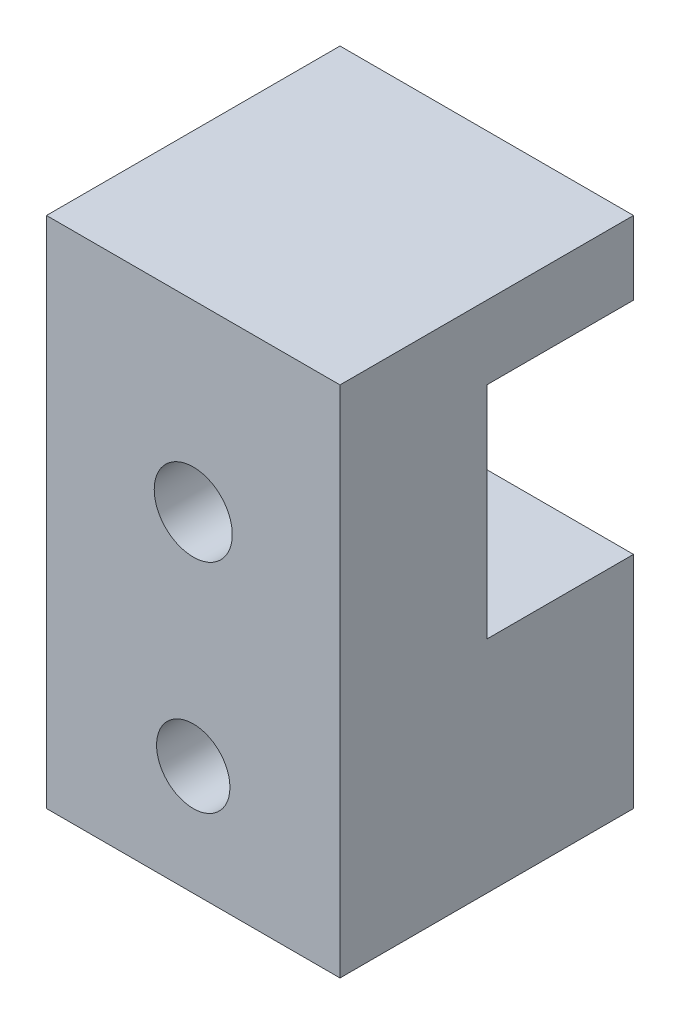
ISO-10303-21;
HEADER;
FILE_DESCRIPTION(('STEP AP214'),'2;1');
FILE_NAME('part.step','',(''),(''),'','','');
FILE_SCHEMA(('AUTOMOTIVE_DESIGN { 1 0 10303 214 1 1 1 1 }'));
ENDSEC;
DATA;
#1=APPLICATION_CONTEXT('core data for automotive mechanical design processes');
#2=APPLICATION_PROTOCOL_DEFINITION('international standard','automotive_design',2000,#1);
#3=PRODUCT_CONTEXT('',#1,'mechanical');
#4=PRODUCT('Part','Part','',(#3));
#5=PRODUCT_RELATED_PRODUCT_CATEGORY('part','',(#4));
#6=PRODUCT_DEFINITION_FORMATION('','',#4);
#7=PRODUCT_DEFINITION_CONTEXT('part definition',#1,'design');
#8=PRODUCT_DEFINITION('design','',#6,#7);
#9=PRODUCT_DEFINITION_SHAPE('','',#8);
#10=(LENGTH_UNIT() NAMED_UNIT(*) SI_UNIT(.MILLI.,.METRE.));
#11=(NAMED_UNIT(*) PLANE_ANGLE_UNIT() SI_UNIT($,.RADIAN.));
#12=(NAMED_UNIT(*) SI_UNIT($,.STERADIAN.) SOLID_ANGLE_UNIT());
#13=UNCERTAINTY_MEASURE_WITH_UNIT(LENGTH_MEASURE(1.E-05),#10,'distance_accuracy_value','');
#14=(GEOMETRIC_REPRESENTATION_CONTEXT(3) GLOBAL_UNCERTAINTY_ASSIGNED_CONTEXT((#13)) GLOBAL_UNIT_ASSIGNED_CONTEXT((#10,
#11,#12)) REPRESENTATION_CONTEXT('',''));
#15=CARTESIAN_POINT('',(0.,0.,0.));
#16=DIRECTION('',(0.,0.,1.));
#17=DIRECTION('',(1.,0.,0.));
#18=AXIS2_PLACEMENT_3D('',#15,#16,#17);
#19=CARTESIAN_POINT('',(0.,0.,-12.7));
#20=DIRECTION('',(0.,0.,-1.));
#21=DIRECTION('',(-1.,0.,0.));
#22=AXIS2_PLACEMENT_3D('',#19,#20,#21);
#23=PLANE('',#22);
#24=CARTESIAN_POINT('',(0.,-12.7,-12.7));
#25=DIRECTION('',(0.,0.,1.));
#26=DIRECTION('',(1.,0.,0.));
#27=AXIS2_PLACEMENT_3D('',#24,#25,#26);
#28=CIRCLE('',#27,3.175);
#29=CARTESIAN_POINT('',(3.175,-12.7,-12.7));
#30=VERTEX_POINT('',#29);
#31=EDGE_CURVE('E194',#30,#30,#28,.T.);
#32=ORIENTED_EDGE('',*,*,#31,.T.);
#33=EDGE_LOOP('',(#32));
#34=FACE_BOUND('',#33,.T.);
#35=DIRECTION('',(-1.,0.,0.));
#36=VECTOR('',#35,1.);
#37=CARTESIAN_POINT('',(12.7,-3.17500000000001,-12.7));
#38=LINE('',#37,#36);
#39=CARTESIAN_POINT('',(12.7,-3.17500000000001,-12.7));
#40=VERTEX_POINT('',#39);
#41=CARTESIAN_POINT('',(-12.7,-3.17500000000001,-12.7));
#42=VERTEX_POINT('',#41);
#43=EDGE_CURVE('E131',#40,#42,#38,.T.);
#44=ORIENTED_EDGE('',*,*,#43,.F.);
#45=DIRECTION('',(0.,1.,0.));
#46=VECTOR('',#45,1.);
#47=CARTESIAN_POINT('',(12.7,-22.225,-12.7));
#48=LINE('',#47,#46);
#49=CARTESIAN_POINT('',(12.7,-22.225,-12.7));
#50=VERTEX_POINT('',#49);
#51=EDGE_CURVE('E166',#50,#40,#48,.T.);
#52=ORIENTED_EDGE('',*,*,#51,.F.);
#53=DIRECTION('',(1.,0.,0.));
#54=VECTOR('',#53,1.);
#55=CARTESIAN_POINT('',(-12.7,-22.225,-12.7));
#56=LINE('',#55,#54);
#57=CARTESIAN_POINT('',(-12.7,-22.225,-12.7));
#58=VERTEX_POINT('',#57);
#59=EDGE_CURVE('E148',#58,#50,#56,.T.);
#60=ORIENTED_EDGE('',*,*,#59,.F.);
#61=DIRECTION('',(0.,1.,0.));
#62=VECTOR('',#61,1.);
#63=CARTESIAN_POINT('',(-12.7,-22.225,-12.7));
#64=LINE('',#63,#62);
#65=EDGE_CURVE('E157',#58,#42,#64,.T.);
#66=ORIENTED_EDGE('',*,*,#65,.T.);
#67=EDGE_LOOP('',(#44,#52,#60,#66));
#68=FACE_BOUND('',#67,.T.);
#69=ADVANCED_FACE('F41',(#34,#68),#23,.T.);
#70=CARTESIAN_POINT('',(-12.7,-22.225,12.7));
#71=DIRECTION('',(-1.,0.,0.));
#72=DIRECTION('',(0.,0.,1.));
#73=AXIS2_PLACEMENT_3D('',#70,#71,#72);
#74=PLANE('',#73);
#75=DIRECTION('',(0.,0.,-1.));
#76=VECTOR('',#75,1.);
#77=CARTESIAN_POINT('',(-12.7,-3.17500000000001,0.));
#78=LINE('',#77,#76);
#79=CARTESIAN_POINT('',(-12.7,-3.17500000000001,0.));
#80=VERTEX_POINT('',#79);
#81=EDGE_CURVE('E186',#80,#42,#78,.T.);
#82=ORIENTED_EDGE('',*,*,#81,.T.);
#83=ORIENTED_EDGE('',*,*,#65,.F.);
#84=DIRECTION('',(0.,0.,-1.));
#85=VECTOR('',#84,1.);
#86=CARTESIAN_POINT('',(-12.7,-22.225,12.7));
#87=LINE('',#86,#85);
#88=CARTESIAN_POINT('',(-12.7,-22.225,12.7));
#89=VERTEX_POINT('',#88);
#90=EDGE_CURVE('E11',#89,#58,#87,.T.);
#91=ORIENTED_EDGE('',*,*,#90,.F.);
#92=DIRECTION('',(0.,1.,0.));
#93=VECTOR('',#92,1.);
#94=CARTESIAN_POINT('',(-12.7,-22.225,12.7));
#95=LINE('',#94,#93);
#96=CARTESIAN_POINT('',(-12.7,22.225,12.7));
#97=VERTEX_POINT('',#96);
#98=EDGE_CURVE('E144',#89,#97,#95,.T.);
#99=ORIENTED_EDGE('',*,*,#98,.T.);
#100=DIRECTION('',(0.,0.,-1.));
#101=VECTOR('',#100,1.);
#102=CARTESIAN_POINT('',(-12.7,22.225,12.7));
#103=LINE('',#102,#101);
#104=CARTESIAN_POINT('',(-12.7,22.225,-12.7));
#105=VERTEX_POINT('',#104);
#106=EDGE_CURVE('E45',#97,#105,#103,.T.);
#107=ORIENTED_EDGE('',*,*,#106,.T.);
#108=CARTESIAN_POINT('',(-12.7,15.875,-12.7));
#109=VERTEX_POINT('',#108);
#110=EDGE_CURVE('E134',#109,#105,#64,.T.);
#111=ORIENTED_EDGE('',*,*,#110,.F.);
#112=DIRECTION('',(0.,0.,-1.));
#113=VECTOR('',#112,1.);
#114=CARTESIAN_POINT('',(-12.7,15.875,0.));
#115=LINE('',#114,#113);
#116=CARTESIAN_POINT('',(-12.7,15.875,0.));
#117=VERTEX_POINT('',#116);
#118=EDGE_CURVE('E59',#117,#109,#115,.T.);
#119=ORIENTED_EDGE('',*,*,#118,.F.);
#120=DIRECTION('',(0.,1.,0.));
#121=VECTOR('',#120,1.);
#122=CARTESIAN_POINT('',(-12.7,-3.17500000000001,0.));
#123=LINE('',#122,#121);
#124=EDGE_CURVE('E122',#80,#117,#123,.T.);
#125=ORIENTED_EDGE('',*,*,#124,.F.);
#126=EDGE_LOOP('',(#82,#83,#91,#99,#107,#111,#119,#125));
#127=FACE_BOUND('',#126,.T.);
#128=ADVANCED_FACE('F43',(#127),#74,.T.);
#129=CARTESIAN_POINT('',(-12.7,-22.225,12.7));
#130=DIRECTION('',(0.,1.,0.));
#131=DIRECTION('',(0.,0.,1.));
#132=AXIS2_PLACEMENT_3D('',#129,#130,#131);
#133=PLANE('',#132);
#134=CARTESIAN_POINT('',(0.,-22.225,0.));
#135=DIRECTION('',(0.,-1.,0.));
#136=DIRECTION('',(0.,0.,-1.));
#137=AXIS2_PLACEMENT_3D('',#134,#135,#136);
#138=CIRCLE('',#137,1.35254999999999);
#139=CARTESIAN_POINT('',(0.,-22.225,-1.35254999999999));
#140=VERTEX_POINT('',#139);
#141=EDGE_CURVE('E222',#140,#140,#138,.T.);
#142=ORIENTED_EDGE('',*,*,#141,.F.);
#143=EDGE_LOOP('',(#142));
#144=FACE_BOUND('',#143,.T.);
#145=ORIENTED_EDGE('',*,*,#59,.T.);
#146=DIRECTION('',(0.,0.,-1.));
#147=VECTOR('',#146,1.);
#148=CARTESIAN_POINT('',(12.7,-22.225,12.7));
#149=LINE('',#148,#147);
#150=CARTESIAN_POINT('',(12.7,-22.225,12.7));
#151=VERTEX_POINT('',#150);
#152=EDGE_CURVE('E51',#151,#50,#149,.T.);
#153=ORIENTED_EDGE('',*,*,#152,.F.);
#154=DIRECTION('',(1.,0.,0.));
#155=VECTOR('',#154,1.);
#156=CARTESIAN_POINT('',(-12.7,-22.225,12.7));
#157=LINE('',#156,#155);
#158=EDGE_CURVE('E154',#89,#151,#157,.T.);
#159=ORIENTED_EDGE('',*,*,#158,.F.);
#160=ORIENTED_EDGE('',*,*,#90,.T.);
#161=EDGE_LOOP('',(#145,#153,#159,#160));
#162=FACE_BOUND('',#161,.T.);
#163=ADVANCED_FACE('F243',(#144,#162),#133,.F.);
#164=CARTESIAN_POINT('',(12.7,-22.225,12.7));
#165=DIRECTION('',(-1.,0.,0.));
#166=DIRECTION('',(0.,0.,1.));
#167=AXIS2_PLACEMENT_3D('',#164,#165,#166);
#168=PLANE('',#167);
#169=ORIENTED_EDGE('',*,*,#51,.T.);
#170=DIRECTION('',(0.,0.,-1.));
#171=VECTOR('',#170,1.);
#172=CARTESIAN_POINT('',(12.7,-3.17500000000001,0.));
#173=LINE('',#172,#171);
#174=CARTESIAN_POINT('',(12.7,-3.17500000000001,0.));
#175=VERTEX_POINT('',#174);
#176=EDGE_CURVE('E139',#175,#40,#173,.T.);
#177=ORIENTED_EDGE('',*,*,#176,.F.);
#178=DIRECTION('',(0.,-1.,0.));
#179=VECTOR('',#178,1.);
#180=CARTESIAN_POINT('',(12.7,-3.17500000000001,0.));
#181=LINE('',#180,#179);
#182=CARTESIAN_POINT('',(12.7,15.875,0.));
#183=VERTEX_POINT('',#182);
#184=EDGE_CURVE('E121',#183,#175,#181,.T.);
#185=ORIENTED_EDGE('',*,*,#184,.F.);
#186=DIRECTION('',(0.,0.,-1.));
#187=VECTOR('',#186,1.);
#188=CARTESIAN_POINT('',(12.7,15.875,0.));
#189=LINE('',#188,#187);
#190=CARTESIAN_POINT('',(12.7,15.875,-12.7));
#191=VERTEX_POINT('',#190);
#192=EDGE_CURVE('E117',#183,#191,#189,.T.);
#193=ORIENTED_EDGE('',*,*,#192,.T.);
#194=CARTESIAN_POINT('',(12.7,22.225,-12.7));
#195=VERTEX_POINT('',#194);
#196=EDGE_CURVE('E165',#191,#195,#48,.T.);
#197=ORIENTED_EDGE('',*,*,#196,.T.);
#198=DIRECTION('',(0.,0.,-1.));
#199=VECTOR('',#198,1.);
#200=CARTESIAN_POINT('',(12.7,22.225,12.7));
#201=LINE('',#200,#199);
#202=CARTESIAN_POINT('',(12.7,22.225,12.7));
#203=VERTEX_POINT('',#202);
#204=EDGE_CURVE('E174',#203,#195,#201,.T.);
#205=ORIENTED_EDGE('',*,*,#204,.F.);
#206=DIRECTION('',(0.,1.,0.));
#207=VECTOR('',#206,1.);
#208=CARTESIAN_POINT('',(12.7,-22.225,12.7));
#209=LINE('',#208,#207);
#210=EDGE_CURVE('E151',#151,#203,#209,.T.);
#211=ORIENTED_EDGE('',*,*,#210,.F.);
#212=ORIENTED_EDGE('',*,*,#152,.T.);
#213=EDGE_LOOP('',(#169,#177,#185,#193,#197,#205,#211,#212));
#214=FACE_BOUND('',#213,.T.);
#215=ADVANCED_FACE('F260',(#214),#168,.F.);
#216=CARTESIAN_POINT('',(-12.7,22.225,12.7));
#217=DIRECTION('',(0.,1.,0.));
#218=DIRECTION('',(0.,0.,1.));
#219=AXIS2_PLACEMENT_3D('',#216,#217,#218);
#220=PLANE('',#219);
#221=DIRECTION('',(1.,0.,0.));
#222=VECTOR('',#221,1.);
#223=CARTESIAN_POINT('',(-12.7,22.225,-12.7));
#224=LINE('',#223,#222);
#225=EDGE_CURVE('E161',#105,#195,#224,.T.);
#226=ORIENTED_EDGE('',*,*,#225,.F.);
#227=ORIENTED_EDGE('',*,*,#106,.F.);
#228=DIRECTION('',(1.,0.,0.));
#229=VECTOR('',#228,1.);
#230=CARTESIAN_POINT('',(-12.7,22.225,12.7));
#231=LINE('',#230,#229);
#232=EDGE_CURVE('E147',#97,#203,#231,.T.);
#233=ORIENTED_EDGE('',*,*,#232,.T.);
#234=ORIENTED_EDGE('',*,*,#204,.T.);
#235=EDGE_LOOP('',(#226,#227,#233,#234));
#236=FACE_BOUND('',#235,.T.);
#237=ADVANCED_FACE('F180',(#236),#220,.T.);
#238=CARTESIAN_POINT('',(0.,0.,12.7));
#239=DIRECTION('',(0.,0.,-1.));
#240=DIRECTION('',(-1.,0.,0.));
#241=AXIS2_PLACEMENT_3D('',#238,#239,#240);
#242=PLANE('',#241);
#243=CARTESIAN_POINT('',(0.,6.35,12.7));
#244=DIRECTION('',(0.,0.,-1.));
#245=DIRECTION('',(-1.,0.,0.));
#246=AXIS2_PLACEMENT_3D('',#243,#244,#245);
#247=CIRCLE('',#246,3.3782);
#248=CARTESIAN_POINT('',(-3.3782,6.35,12.7));
#249=VERTEX_POINT('',#248);
#250=EDGE_CURVE('E202',#249,#249,#247,.T.);
#251=ORIENTED_EDGE('',*,*,#250,.T.);
#252=EDGE_LOOP('',(#251));
#253=FACE_BOUND('',#252,.T.);
#254=CARTESIAN_POINT('',(0.,-12.7,12.7));
#255=DIRECTION('',(0.,0.,1.));
#256=DIRECTION('',(1.,0.,0.));
#257=AXIS2_PLACEMENT_3D('',#254,#255,#256);
#258=CIRCLE('',#257,3.175);
#259=CARTESIAN_POINT('',(3.175,-12.7,12.7));
#260=VERTEX_POINT('',#259);
#261=EDGE_CURVE('E198',#260,#260,#258,.T.);
#262=ORIENTED_EDGE('',*,*,#261,.F.);
#263=EDGE_LOOP('',(#262));
#264=FACE_BOUND('',#263,.T.);
#265=ORIENTED_EDGE('',*,*,#98,.F.);
#266=ORIENTED_EDGE('',*,*,#158,.T.);
#267=ORIENTED_EDGE('',*,*,#210,.T.);
#268=ORIENTED_EDGE('',*,*,#232,.F.);
#269=EDGE_LOOP('',(#265,#266,#267,#268));
#270=FACE_BOUND('',#269,.T.);
#271=ADVANCED_FACE('F249',(#253,#264,#270),#242,.F.);
#272=DIRECTION('',(1.,0.,0.));
#273=VECTOR('',#272,1.);
#274=CARTESIAN_POINT('',(12.7,15.875,-12.7));
#275=LINE('',#274,#273);
#276=EDGE_CURVE('E184',#109,#191,#275,.T.);
#277=ORIENTED_EDGE('',*,*,#276,.F.);
#278=ORIENTED_EDGE('',*,*,#110,.T.);
#279=ORIENTED_EDGE('',*,*,#225,.T.);
#280=ORIENTED_EDGE('',*,*,#196,.F.);
#281=EDGE_LOOP('',(#277,#278,#279,#280));
#282=FACE_BOUND('',#281,.T.);
#283=ADVANCED_FACE('F183',(#282),#23,.T.);
#284=CARTESIAN_POINT('',(12.7,-3.17500000000001,0.));
#285=DIRECTION('',(0.,-1.,0.));
#286=DIRECTION('',(0.,0.,-1.));
#287=AXIS2_PLACEMENT_3D('',#284,#285,#286);
#288=PLANE('',#287);
#289=ORIENTED_EDGE('',*,*,#43,.T.);
#290=ORIENTED_EDGE('',*,*,#81,.F.);
#291=DIRECTION('',(-1.,0.,0.));
#292=VECTOR('',#291,1.);
#293=CARTESIAN_POINT('',(12.7,-3.17500000000001,0.));
#294=LINE('',#293,#292);
#295=EDGE_CURVE('E128',#175,#80,#294,.T.);
#296=ORIENTED_EDGE('',*,*,#295,.F.);
#297=ORIENTED_EDGE('',*,*,#176,.T.);
#298=EDGE_LOOP('',(#289,#290,#296,#297));
#299=FACE_BOUND('',#298,.T.);
#300=ADVANCED_FACE('F248',(#299),#288,.F.);
#301=CARTESIAN_POINT('',(12.7,15.875,0.));
#302=DIRECTION('',(0.,1.,0.));
#303=DIRECTION('',(-1.,0.,0.));
#304=AXIS2_PLACEMENT_3D('',#301,#302,#303);
#305=PLANE('',#304);
#306=ORIENTED_EDGE('',*,*,#276,.T.);
#307=ORIENTED_EDGE('',*,*,#192,.F.);
#308=DIRECTION('',(1.,0.,0.));
#309=VECTOR('',#308,1.);
#310=CARTESIAN_POINT('',(12.7,15.875,0.));
#311=LINE('',#310,#309);
#312=EDGE_CURVE('E113',#117,#183,#311,.T.);
#313=ORIENTED_EDGE('',*,*,#312,.F.);
#314=ORIENTED_EDGE('',*,*,#118,.T.);
#315=EDGE_LOOP('',(#306,#307,#313,#314));
#316=FACE_BOUND('',#315,.T.);
#317=ADVANCED_FACE('F115',(#316),#305,.F.);
#318=CARTESIAN_POINT('',(0.,0.,0.));
#319=DIRECTION('',(0.,0.,1.));
#320=DIRECTION('',(1.,0.,0.));
#321=AXIS2_PLACEMENT_3D('',#318,#319,#320);
#322=PLANE('',#321);
#323=CARTESIAN_POINT('',(0.,6.35,0.));
#324=DIRECTION('',(0.,0.,-1.));
#325=DIRECTION('',(-1.,0.,0.));
#326=AXIS2_PLACEMENT_3D('',#323,#324,#325);
#327=CIRCLE('',#326,3.37819999999999);
#328=CARTESIAN_POINT('',(-3.37819999999999,6.35,0.));
#329=VERTEX_POINT('',#328);
#330=EDGE_CURVE('E209',#329,#329,#327,.T.);
#331=ORIENTED_EDGE('',*,*,#330,.F.);
#332=EDGE_LOOP('',(#331));
#333=FACE_BOUND('',#332,.T.);
#334=ORIENTED_EDGE('',*,*,#124,.T.);
#335=ORIENTED_EDGE('',*,*,#312,.T.);
#336=ORIENTED_EDGE('',*,*,#184,.T.);
#337=ORIENTED_EDGE('',*,*,#295,.T.);
#338=EDGE_LOOP('',(#334,#335,#336,#337));
#339=FACE_BOUND('',#338,.T.);
#340=ADVANCED_FACE('F126',(#333,#339),#322,.F.);
#341=CARTESIAN_POINT('',(0.,-12.7,-12.7));
#342=DIRECTION('',(0.,0.,1.));
#343=DIRECTION('',(1.,0.,0.));
#344=AXIS2_PLACEMENT_3D('',#341,#342,#343);
#345=CYLINDRICAL_SURFACE('',#344,3.175);
#346=CARTESIAN_POINT('',(0.,-15.875,-1.35255));
#347=CARTESIAN_POINT('',(0.0723119803182966,-15.8749937642741,-1.35254177520316));
#348=CARTESIAN_POINT('',(0.14473035596944,-15.87250122266,-1.34671677085275));
#349=CARTESIAN_POINT('',(0.287508253069318,-15.8627706679962,-1.32362700946327));
#350=CARTESIAN_POINT('',(0.357862061157261,-15.8555205850516,-1.30633315473188));
#351=CARTESIAN_POINT('',(0.494208939922366,-15.8370524239494,-1.26106652134826));
#352=CARTESIAN_POINT('',(0.560216141686438,-15.8258480428276,-1.23313057893921));
#353=CARTESIAN_POINT('',(0.686540807637016,-15.8005551810215,-1.16752831329107));
#354=CARTESIAN_POINT('',(0.746859846370327,-15.7864675019097,-1.12986469363826));
#355=CARTESIAN_POINT('',(0.863330621553542,-15.7559908466859,-1.0438105223501));
#356=CARTESIAN_POINT('',(0.919148042993751,-15.7395243177154,-0.994995222634551));
#357=CARTESIAN_POINT('',(1.02209379973983,-15.7064727145596,-0.888922536238246));
#358=CARTESIAN_POINT('',(1.06921736595388,-15.6898875804631,-0.831660546858982));
#359=CARTESIAN_POINT('',(1.15586188650404,-15.6575091747147,-0.706716145718508));
#360=CARTESIAN_POINT('',(1.19486044876667,-15.6418018524763,-0.638646839132887));
#361=CARTESIAN_POINT('',(1.26070499788386,-15.6141949309884,-0.49615021576441));
#362=CARTESIAN_POINT('',(1.28755752377759,-15.6022932838985,-0.421726345794151));
#363=CARTESIAN_POINT('',(1.32695137173236,-15.5844885408188,-0.272481782098255));
#364=CARTESIAN_POINT('',(1.34013766580825,-15.5783167011884,-0.197864666492723));
#365=CARTESIAN_POINT('',(1.35383505668087,-15.5719016392898,-0.0472414110769818));
#366=CARTESIAN_POINT('',(1.35435360727362,-15.5716549306313,0.0287638855657464));
#367=CARTESIAN_POINT('',(1.34318495882507,-15.576891622832,0.17344353783806));
#368=CARTESIAN_POINT('',(1.3324808719224,-15.5819135133643,0.242213910729962));
#369=CARTESIAN_POINT('',(1.30082548820464,-15.5963386121171,0.376868979127113));
#370=CARTESIAN_POINT('',(1.27987212223332,-15.6057427050121,0.442753089017098));
#371=CARTESIAN_POINT('',(1.22790087368373,-15.6280874894987,0.571467277566886));
#372=CARTESIAN_POINT('',(1.19667432188826,-15.6411005434402,0.634199971759613));
#373=CARTESIAN_POINT('',(1.12519137808888,-15.6691819937329,0.75378622580584));
#374=CARTESIAN_POINT('',(1.08493133768207,-15.6842512195549,0.810637396664926));
#375=CARTESIAN_POINT('',(0.992333949928197,-15.7163725359364,0.922155886563746));
#376=CARTESIAN_POINT('',(0.939241995039336,-15.7334819320518,0.976181952101855));
#377=CARTESIAN_POINT('',(0.824589839165172,-15.7666325963742,1.07478447159878));
#378=CARTESIAN_POINT('',(0.763027479068142,-15.7826735906928,1.11935850884433));
#379=CARTESIAN_POINT('',(0.631157998604149,-15.8123848687919,1.19879081738165));
#380=CARTESIAN_POINT('',(0.560670064560459,-15.8259854827022,1.23337691862214));
#381=CARTESIAN_POINT('',(0.414148596926305,-15.8487438815602,1.28997295749315));
#382=CARTESIAN_POINT('',(0.338118299445439,-15.8579042355869,1.31199016864093));
#383=CARTESIAN_POINT('',(0.188019452335296,-15.8702633255804,1.34145508065906));
#384=CARTESIAN_POINT('',(0.11414861786965,-15.8738132596229,1.3497626553015));
#385=CARTESIAN_POINT('',(-0.0340114282148169,-15.8756810536664,1.35415007319995));
#386=CARTESIAN_POINT('',(-0.108300505854284,-15.8740005035043,1.35023363201765));
#387=CARTESIAN_POINT('',(-0.251086365945456,-15.8658224359986,1.33088956002412));
#388=CARTESIAN_POINT('',(-0.319682718417006,-15.8595818575747,1.31607566728751));
#389=CARTESIAN_POINT('',(-0.453335115246511,-15.8431908203879,1.27622243273565));
#390=CARTESIAN_POINT('',(-0.518390716382746,-15.8330398734145,1.25118181408735));
#391=CARTESIAN_POINT('',(-0.645410792119004,-15.8094011706193,1.19077167332886));
#392=CARTESIAN_POINT('',(-0.707215459370453,-15.7958191739096,1.15510422025461));
#393=CARTESIAN_POINT('',(-0.824184879794795,-15.7667543961393,1.07477896391606));
#394=CARTESIAN_POINT('',(-0.879346794690437,-15.7512708082447,1.03011733930006));
#395=CARTESIAN_POINT('',(-0.98579077872458,-15.7186367656367,0.92918239725146));
#396=CARTESIAN_POINT('',(-1.03647723077649,-15.701448088634,0.872291725552817));
#397=CARTESIAN_POINT('',(-1.12776122684815,-15.6683569253816,0.750556976311338));
#398=CARTESIAN_POINT('',(-1.16835608123138,-15.6524547827821,0.685710785307664));
#399=CARTESIAN_POINT('',(-1.23885812859457,-15.6235830304592,0.548342425907143));
#400=CARTESIAN_POINT('',(-1.26857052110254,-15.6106682662558,0.47570788264342));
#401=CARTESIAN_POINT('',(-1.31507928002952,-15.5899570175754,0.325740640673738));
#402=CARTESIAN_POINT('',(-1.3318869503345,-15.5821560545443,0.248412117884264));
#403=CARTESIAN_POINT('',(-1.35096216089002,-15.5732606642568,0.0978910164841006));
#404=CARTESIAN_POINT('',(-1.35428166989025,-15.5716813318463,0.0248599209182079));
#405=CARTESIAN_POINT('',(-1.34912066967993,-15.5741098051682,-0.120681637221437));
#406=CARTESIAN_POINT('',(-1.34064217966592,-15.5781166548405,-0.193192186750541));
#407=CARTESIAN_POINT('',(-1.31302255224126,-15.5908143557209,-0.331824440239765));
#408=CARTESIAN_POINT('',(-1.29444551613291,-15.5992566725101,-0.398083526320236));
#409=CARTESIAN_POINT('',(-1.24772175082134,-15.6196681066913,-0.526552401255483));
#410=CARTESIAN_POINT('',(-1.21957230769733,-15.6316382241392,-0.588761035780507));
#411=CARTESIAN_POINT('',(-1.15251036671547,-15.6586697417082,-0.711549455942926));
#412=CARTESIAN_POINT('',(-1.11304177860359,-15.6738761215368,-0.771792976400169));
#413=CARTESIAN_POINT('',(-1.02522167499384,-15.7052817958994,-0.88513050272946));
#414=CARTESIAN_POINT('',(-0.976866860266102,-15.7214814577203,-0.938221840448121));
#415=CARTESIAN_POINT('',(-0.8681998600487,-15.7545572221164,-1.03999082551859));
#416=CARTESIAN_POINT('',(-0.807251096145337,-15.7713883206596,-1.08800664347723));
#417=CARTESIAN_POINT('',(-0.677547032947665,-15.8025791648252,-1.17317457940271));
#418=CARTESIAN_POINT('',(-0.608788212504219,-15.8169377883381,-1.21032177006529));
#419=CARTESIAN_POINT('',(-0.466349244720164,-15.8413831201725,-1.27194468564941));
#420=CARTESIAN_POINT('',(-0.392758601835343,-15.8515307940795,-1.29660247811649));
#421=CARTESIAN_POINT('',(-0.242078283854139,-15.8666558426973,-1.33295039769719));
#422=CARTESIAN_POINT('',(-0.165000257484024,-15.8716492698085,-1.34468079369904));
#423=CARTESIAN_POINT('',(-0.058401327876809,-15.8745993632115,-1.35160755828298));
#424=CARTESIAN_POINT('',(-0.0292093438574401,-15.8750025188283,-1.35255332228377));
#425=CARTESIAN_POINT('',(0.,-15.875,-1.35255));
#426=B_SPLINE_CURVE_WITH_KNOTS('',3,(#346,#347,#348,#349,#350,#351,#352,#353,#354,#355,#356,
#357,#358,#359,#360,#361,#362,#363,#364,#365,#366,#367,#368,#369,#370,#371,#372,#373,#374,#375,
#376,#377,#378,#379,#380,#381,#382,#383,#384,#385,#386,#387,#388,#389,#390,#391,#392,#393,#394,
#395,#396,#397,#398,#399,#400,#401,#402,#403,#404,#405,#406,#407,#408,#409,#410,#411,#412,#413,
#414,#415,#416,#417,#418,#419,#420,#421,#422,#423,#424,#425),.UNSPECIFIED.,.T.,.F.,(4,2,2,2,2,2,
2,2,2,2,2,2,2,2,2,2,2,2,2,2,2,2,2,2,2,2,2,2,2,2,2,2,2,2,2,2,2,2,2,4),(0.,0.216850050638944,
0.434252388523416,0.65090895436824,0.867505370130751,1.09439609589244,1.32141091689531,
1.56022386511507,1.79890809057365,2.02572902648838,2.25241649603316,2.46078251280767,
2.66919061253204,2.88212426261053,3.0951440666222,3.32706321416167,3.55904158793932,
3.79684693152948,4.03451451918156,4.25661426582136,4.47864651050859,4.68904802527597,
4.89947581724864,5.11647002970508,5.33355663169254,5.56682347195773,5.80015241655904,
6.03747459229677,6.27458864785545,6.4928070277458,6.71098806472671,6.91807492424946,
7.12522054501712,7.34512352029502,7.56510830550802,7.80215736760163,8.03931373022259,
8.2729054890571,8.50576753373725,8.59336087119994),.UNSPECIFIED.);
#427=CARTESIAN_POINT('',(0.,-15.875,-1.35255));
#428=VERTEX_POINT('',#427);
#429=EDGE_CURVE('E213',#428,#428,#426,.T.);
#430=ORIENTED_EDGE('',*,*,#429,.T.);
#431=EDGE_LOOP('',(#430));
#432=FACE_BOUND('',#431,.T.);
#433=ORIENTED_EDGE('',*,*,#31,.F.);
#434=EDGE_LOOP('',(#433));
#435=FACE_BOUND('',#434,.T.);
#436=ORIENTED_EDGE('',*,*,#261,.T.);
#437=EDGE_LOOP('',(#436));
#438=FACE_BOUND('',#437,.T.);
#439=ADVANCED_FACE('F233',(#432,#435,#438),#345,.F.);
#440=CARTESIAN_POINT('',(0.,6.35,0.));
#441=DIRECTION('',(0.,0.,-1.));
#442=DIRECTION('',(-1.,0.,0.));
#443=AXIS2_PLACEMENT_3D('',#440,#441,#442);
#444=CYLINDRICAL_SURFACE('',#443,3.37819999999999);
#445=ORIENTED_EDGE('',*,*,#250,.F.);
#446=EDGE_LOOP('',(#445));
#447=FACE_BOUND('',#446,.T.);
#448=ORIENTED_EDGE('',*,*,#330,.T.);
#449=EDGE_LOOP('',(#448));
#450=FACE_BOUND('',#449,.T.);
#451=ADVANCED_FACE('F228',(#447,#450),#444,.F.);
#452=CARTESIAN_POINT('',(0.,-22.225,0.));
#453=DIRECTION('',(0.,-1.,0.));
#454=DIRECTION('',(0.,0.,-1.));
#455=AXIS2_PLACEMENT_3D('',#452,#453,#454);
#456=CYLINDRICAL_SURFACE('',#455,1.35255);
#457=ORIENTED_EDGE('',*,*,#429,.F.);
#458=EDGE_LOOP('',(#457));
#459=FACE_BOUND('',#458,.T.);
#460=ORIENTED_EDGE('',*,*,#141,.T.);
#461=EDGE_LOOP('',(#460));
#462=FACE_BOUND('',#461,.T.);
#463=ADVANCED_FACE('F225',(#459,#462),#456,.F.);
#464=CLOSED_SHELL('',(#69,#128,#163,#215,#237,#271,#283,#300,#317,#340,#439,#451,#463));
#465=MANIFOLD_SOLID_BREP('B2',#464);
#466=ADVANCED_BREP_SHAPE_REPRESENTATION('',(#18,#465),#14);
#467=SHAPE_DEFINITION_REPRESENTATION(#9,#466);
ENDSEC;
END-ISO-10303-21;
